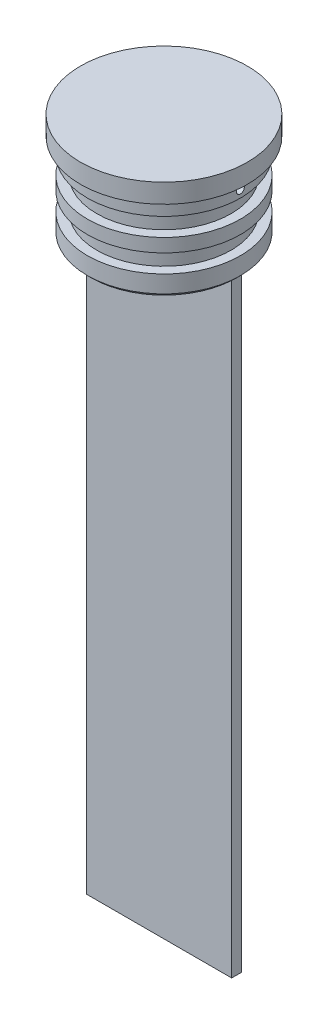
ISO-10303-21;
HEADER;
FILE_DESCRIPTION(('STEP AP214'),'2;1');
FILE_NAME('part.step','',(''),(''),'','','');
FILE_SCHEMA(('AUTOMOTIVE_DESIGN { 1 0 10303 214 1 1 1 1 }'));
ENDSEC;
DATA;
#1=APPLICATION_CONTEXT('core data for automotive mechanical design processes');
#2=APPLICATION_PROTOCOL_DEFINITION('international standard','automotive_design',2000,#1);
#3=PRODUCT_CONTEXT('',#1,'mechanical');
#4=PRODUCT('Part','Part','',(#3));
#5=PRODUCT_RELATED_PRODUCT_CATEGORY('part','',(#4));
#6=PRODUCT_DEFINITION_FORMATION('','',#4);
#7=PRODUCT_DEFINITION_CONTEXT('part definition',#1,'design');
#8=PRODUCT_DEFINITION('design','',#6,#7);
#9=PRODUCT_DEFINITION_SHAPE('','',#8);
#10=(LENGTH_UNIT() NAMED_UNIT(*) SI_UNIT(.MILLI.,.METRE.));
#11=(NAMED_UNIT(*) PLANE_ANGLE_UNIT() SI_UNIT($,.RADIAN.));
#12=(NAMED_UNIT(*) SI_UNIT($,.STERADIAN.) SOLID_ANGLE_UNIT());
#13=UNCERTAINTY_MEASURE_WITH_UNIT(LENGTH_MEASURE(1.E-05),#10,'distance_accuracy_value','');
#14=(GEOMETRIC_REPRESENTATION_CONTEXT(3) GLOBAL_UNCERTAINTY_ASSIGNED_CONTEXT((#13)) GLOBAL_UNIT_ASSIGNED_CONTEXT((#10,
#11,#12)) REPRESENTATION_CONTEXT('',''));
#15=CARTESIAN_POINT('',(0.,0.,0.));
#16=DIRECTION('',(0.,0.,1.));
#17=DIRECTION('',(1.,0.,0.));
#18=AXIS2_PLACEMENT_3D('',#15,#16,#17);
#19=CARTESIAN_POINT('',(-10.1346,0.,0.));
#20=DIRECTION('',(0.,-1.,0.));
#21=DIRECTION('',(0.,0.,-1.));
#22=AXIS2_PLACEMENT_3D('',#19,#20,#21);
#23=PLANE('',#22);
#24=DIRECTION('',(0.,0.,-1.));
#25=VECTOR('',#24,1.);
#26=CARTESIAN_POINT('',(-9.60563389683367,0.,0.635));
#27=LINE('',#26,#25);
#28=CARTESIAN_POINT('',(-9.60563389683367,0.,0.635));
#29=VERTEX_POINT('',#28);
#30=CARTESIAN_POINT('',(-9.60563389683367,0.,-0.635));
#31=VERTEX_POINT('',#30);
#32=EDGE_CURVE('E66',#29,#31,#27,.T.);
#33=ORIENTED_EDGE('',*,*,#32,.F.);
#34=CARTESIAN_POINT('',(0.,0.,0.));
#35=DIRECTION('',(0.,-1.,0.));
#36=DIRECTION('',(0.,0.,-1.));
#37=AXIS2_PLACEMENT_3D('',#34,#35,#36);
#38=CIRCLE('',#37,9.6266);
#39=EDGE_CURVE('E255',#29,#31,#38,.T.);
#40=ORIENTED_EDGE('',*,*,#39,.T.);
#41=EDGE_LOOP('',(#33,#40));
#42=FACE_BOUND('',#41,.T.);
#43=ADVANCED_FACE('F39',(#42),#23,.T.);
#44=DIRECTION('',(-1.,0.,0.));
#45=VECTOR('',#44,1.);
#46=CARTESIAN_POINT('',(-9.60563389683367,0.,0.635));
#47=LINE('',#46,#45);
#48=CARTESIAN_POINT('',(9.60563389683367,0.,0.635000000000031));
#49=VERTEX_POINT('',#48);
#50=EDGE_CURVE('E107',#49,#29,#47,.T.);
#51=ORIENTED_EDGE('',*,*,#50,.F.);
#52=EDGE_CURVE('E158',#49,#29,#38,.T.);
#53=ORIENTED_EDGE('',*,*,#52,.T.);
#54=EDGE_LOOP('',(#51,#53));
#55=FACE_BOUND('',#54,.T.);
#56=ADVANCED_FACE('F238',(#55),#23,.T.);
#57=DIRECTION('',(0.,0.,1.));
#58=VECTOR('',#57,1.);
#59=CARTESIAN_POINT('',(9.60563389683367,0.,0.635));
#60=LINE('',#59,#58);
#61=CARTESIAN_POINT('',(9.60563389683367,0.,-0.635));
#62=VERTEX_POINT('',#61);
#63=EDGE_CURVE('E251',#62,#49,#60,.T.);
#64=ORIENTED_EDGE('',*,*,#63,.F.);
#65=EDGE_CURVE('E155',#62,#49,#38,.T.);
#66=ORIENTED_EDGE('',*,*,#65,.T.);
#67=EDGE_LOOP('',(#64,#66));
#68=FACE_BOUND('',#67,.T.);
#69=ADVANCED_FACE('F221',(#68),#23,.T.);
#70=CARTESIAN_POINT('',(-10.1346,9.398,0.));
#71=DIRECTION('',(0.,-1.,0.));
#72=DIRECTION('',(0.,0.,-1.));
#73=AXIS2_PLACEMENT_3D('',#70,#71,#72);
#74=PLANE('',#73);
#75=CARTESIAN_POINT('',(0.,9.398,0.));
#76=DIRECTION('',(0.,1.,0.));
#77=DIRECTION('',(0.,0.,1.));
#78=AXIS2_PLACEMENT_3D('',#75,#76,#77);
#79=CIRCLE('',#78,8.89);
#80=CARTESIAN_POINT('',(0.,9.398,8.89));
#81=VERTEX_POINT('',#80);
#82=EDGE_CURVE('E110',#81,#81,#79,.T.);
#83=ORIENTED_EDGE('',*,*,#82,.T.);
#84=EDGE_LOOP('',(#83));
#85=FACE_BOUND('',#84,.T.);
#86=CARTESIAN_POINT('',(0.,9.398,0.));
#87=DIRECTION('',(0.,1.,0.));
#88=DIRECTION('',(0.,0.,1.));
#89=AXIS2_PLACEMENT_3D('',#86,#87,#88);
#90=CIRCLE('',#89,10.1346);
#91=CARTESIAN_POINT('',(0.,9.398,10.1346));
#92=VERTEX_POINT('',#91);
#93=EDGE_CURVE('E147',#92,#92,#90,.T.);
#94=ORIENTED_EDGE('',*,*,#93,.F.);
#95=EDGE_LOOP('',(#94));
#96=FACE_BOUND('',#95,.T.);
#97=ADVANCED_FACE('F234',(#85,#96),#74,.T.);
#98=CARTESIAN_POINT('',(0.,20.3688400990433,0.));
#99=DIRECTION('',(0.,1.,0.));
#100=DIRECTION('',(0.,0.,1.));
#101=AXIS2_PLACEMENT_3D('',#98,#99,#100);
#102=CYLINDRICAL_SURFACE('',#101,10.1346);
#103=CARTESIAN_POINT('',(-10.1205534236029,10.414,-0.5334));
#104=CARTESIAN_POINT('',(-10.1205536121464,10.3840609584769,-0.533398679411755));
#105=CARTESIAN_POINT('',(-10.1206877020375,10.3541007365576,-0.530870874435041));
#106=CARTESIAN_POINT('',(-10.1212096612489,10.2950069409855,-0.520822892998418));
#107=CARTESIAN_POINT('',(-10.1215978288808,10.2658743810902,-0.513296847978016));
#108=CARTESIAN_POINT('',(-10.1225838531584,10.2093004844766,-0.493468598960612));
#109=CARTESIAN_POINT('',(-10.1231816021669,10.1818582881073,-0.481168846307918));
#110=CARTESIAN_POINT('',(-10.1245192993215,10.1294354166762,-0.452146129710222));
#111=CARTESIAN_POINT('',(-10.1252592140841,10.1044541658105,-0.435424203840583));
#112=CARTESIAN_POINT('',(-10.1267988027599,10.0576272805655,-0.398011288975462));
#113=CARTESIAN_POINT('',(-10.1275985339612,10.035784712203,-0.377316464530746));
#114=CARTESIAN_POINT('',(-10.1291671033507,9.99588138533347,-0.332552928942506));
#115=CARTESIAN_POINT('',(-10.1299359402717,9.97782078183791,-0.30848407957522));
#116=CARTESIAN_POINT('',(-10.1313565366544,9.94598541332003,-0.257639408324739));
#117=CARTESIAN_POINT('',(-10.1320082299666,9.93221306662782,-0.230862070245239));
#118=CARTESIAN_POINT('',(-10.1331205179989,9.90936067083067,-0.175371198417729));
#119=CARTESIAN_POINT('',(-10.1335811142802,9.90028058339169,-0.146657680489775));
#120=CARTESIAN_POINT('',(-10.1342589193816,9.88707863839543,-0.0881379998586083));
#121=CARTESIAN_POINT('',(-10.1344763555222,9.88295214965469,-0.0583328846172915));
#122=CARTESIAN_POINT('',(-10.134644101096,9.87976024368991,0.00154771836247045));
#123=CARTESIAN_POINT('',(-10.134594412806,9.88069478332828,0.0316232037942387));
#124=CARTESIAN_POINT('',(-10.1342336998235,9.8875945675563,0.0911594538143426));
#125=CARTESIAN_POINT('',(-10.1339229340489,9.89355482801736,0.120620797809831));
#126=CARTESIAN_POINT('',(-10.1330753650302,9.91032913619272,0.178124219283356));
#127=CARTESIAN_POINT('',(-10.1325385607632,9.92114320587159,0.206166290338221));
#128=CARTESIAN_POINT('',(-10.1312989311418,9.94732383610626,0.260051193995274));
#129=CARTESIAN_POINT('',(-10.1305960230931,9.96269266520918,0.285892922417169));
#130=CARTESIAN_POINT('',(-10.1291033343434,9.99754489422707,0.33463152250589));
#131=CARTESIAN_POINT('',(-10.1283135529589,10.0170283265129,0.357528371002167));
#132=CARTESIAN_POINT('',(-10.1267349172471,10.0595848700228,0.399756326371677));
#133=CARTESIAN_POINT('',(-10.1259460652055,10.0826623057789,0.41908307541589));
#134=CARTESIAN_POINT('',(-10.1244591830369,10.1317365883295,0.453588639978021));
#135=CARTESIAN_POINT('',(-10.1237611529362,10.1577334359645,0.468767454301576));
#136=CARTESIAN_POINT('',(-10.1225347057919,10.2119112443445,0.494545911593178));
#137=CARTESIAN_POINT('',(-10.1220062949581,10.2400922850069,0.505145386914533));
#138=CARTESIAN_POINT('',(-10.121178909836,10.2978373196118,0.52146135654842));
#139=CARTESIAN_POINT('',(-10.1208799336356,10.327401302027,0.527177891554696));
#140=CARTESIAN_POINT('',(-10.120545488096,10.3870350359619,0.53356031175169));
#141=CARTESIAN_POINT('',(-10.1205097030998,10.4171041382515,0.534232247177286));
#142=CARTESIAN_POINT('',(-10.1207048512828,10.4769279380717,0.530522186904345));
#143=CARTESIAN_POINT('',(-10.1209357834831,10.506682636756,0.52614020975667));
#144=CARTESIAN_POINT('',(-10.121638050369,10.5650159858181,0.512451732069377));
#145=CARTESIAN_POINT('',(-10.1221092496993,10.5935952885735,0.503148004104327));
#146=CARTESIAN_POINT('',(-10.1232388289093,10.6487866884438,0.479882929856249));
#147=CARTESIAN_POINT('',(-10.1238972099908,10.6753987729281,0.465921553671906));
#148=CARTESIAN_POINT('',(-10.1253277171654,10.7259281434284,0.433721980065567));
#149=CARTESIAN_POINT('',(-10.126099951034,10.7498428377599,0.415479720484483));
#150=CARTESIAN_POINT('',(-10.1276707492125,10.7942725003387,0.375242141196447));
#151=CARTESIAN_POINT('',(-10.1284693137079,10.8147874446351,0.353246795051487));
#152=CARTESIAN_POINT('',(-10.1300036933725,10.8518556147153,0.306101413291947));
#153=CARTESIAN_POINT('',(-10.1307394461639,10.8684049310707,0.280948301575624));
#154=CARTESIAN_POINT('',(-10.1320643926763,10.897045340145,0.228216926025011));
#155=CARTESIAN_POINT('',(-10.1326535870864,10.9091364538319,0.200638673597497));
#156=CARTESIAN_POINT('',(-10.133618718947,10.9285104060322,0.14385437221848));
#157=CARTESIAN_POINT('',(-10.1339947670791,10.9357957403924,0.11464917676835));
#158=CARTESIAN_POINT('',(-10.1344916679141,10.9453595024191,0.0554280837306605));
#159=CARTESIAN_POINT('',(-10.1346125222624,10.947637962368,0.0254121913714276));
#160=CARTESIAN_POINT('',(-10.1345854227455,10.9471229921062,-0.0345394746706937));
#161=CARTESIAN_POINT('',(-10.1344377937389,10.9443356913491,-0.0644753013446941));
#162=CARTESIAN_POINT('',(-10.1338909845196,10.9337809990915,-0.123453345907919));
#163=CARTESIAN_POINT('',(-10.1334918038383,10.9260135983157,-0.1524955621327));
#164=CARTESIAN_POINT('',(-10.1324867931905,10.905720477635,-0.208863185894305));
#165=CARTESIAN_POINT('',(-10.1318809621863,10.8931947338369,-0.236188584809665));
#166=CARTESIAN_POINT('',(-10.1305307629354,10.8637414953699,-0.288349042122926));
#167=CARTESIAN_POINT('',(-10.1297863988147,10.8468141317844,-0.313184174652245));
#168=CARTESIAN_POINT('',(-10.1282418658416,10.8090160258209,-0.359689863587585));
#169=CARTESIAN_POINT('',(-10.1274416365457,10.7881409691609,-0.381356911342619));
#170=CARTESIAN_POINT('',(-10.1258759936888,10.7430436655474,-0.420885950573217));
#171=CARTESIAN_POINT('',(-10.1251105887333,10.7188205971745,-0.438747005523939));
#172=CARTESIAN_POINT('',(-10.1237003676491,10.6676941717302,-0.470166353728063));
#173=CARTESIAN_POINT('',(-10.1230556744992,10.6407881235861,-0.483720268640747));
#174=CARTESIAN_POINT('',(-10.1219615023649,10.5850989087634,-0.506102014922759));
#175=CARTESIAN_POINT('',(-10.1215117932884,10.5563180009314,-0.514935419636537));
#176=CARTESIAN_POINT('',(-10.120977180716,10.508465661188,-0.525312418960884));
#177=CARTESIAN_POINT('',(-10.1208189744007,10.4897040619379,-0.528341380250392));
#178=CARTESIAN_POINT('',(-10.1206070361096,10.4519644810557,-0.532385588546817));
#179=CARTESIAN_POINT('',(-10.1205533040339,10.4329864996305,-0.533400837479991));
#180=CARTESIAN_POINT('',(-10.1205534236029,10.414,-0.5334));
#181=B_SPLINE_CURVE_WITH_KNOTS('',3,(#103,#104,#105,#106,#107,#108,#109,#110,#111,#112,#113,
#114,#115,#116,#117,#118,#119,#120,#121,#122,#123,#124,#125,#126,#127,#128,#129,#130,#131,#132,
#133,#134,#135,#136,#137,#138,#139,#140,#141,#142,#143,#144,#145,#146,#147,#148,#149,#150,#151,
#152,#153,#154,#155,#156,#157,#158,#159,#160,#161,#162,#163,#164,#165,#166,#167,#168,#169,#170,
#171,#172,#173,#174,#175,#176,#177,#178,#179,#180),.UNSPECIFIED.,.T.,.F.,(4,2,2,2,2,2,2,2,2,2,2,
2,2,2,2,2,2,2,2,2,2,2,2,2,2,2,2,2,2,2,2,2,2,2,2,2,2,2,4),(0.,0.0897478156737939,
0.179601193272618,0.269408491224996,0.359194726203806,0.44906808100993,0.538945118736538,
0.628872750523029,0.718799647621717,0.808642405260603,0.898484397127532,0.988237395173397,
1.07799079937609,1.16778898157327,1.25758787026647,1.34749565760341,1.43740347082852,
1.52731457524271,1.61722493034297,1.70702743430625,1.79682960864202,1.88658124841989,
1.97633346439921,2.06617119372077,2.15600955591574,2.24593612226999,2.33586226567257,
2.42574166973739,2.51562049429241,2.60539063993941,2.69516095278274,2.78493171639607,
2.87469980687735,2.9645665744061,3.05445542960686,3.14443536945332,3.23430883703432,
3.29122443661395,3.34813998174977),.UNSPECIFIED.);
#182=CARTESIAN_POINT('',(-10.1205534236029,10.414,-0.5334));
#183=VERTEX_POINT('',#182);
#184=EDGE_CURVE('E43',#183,#183,#181,.T.);
#185=ORIENTED_EDGE('',*,*,#184,.F.);
#186=EDGE_LOOP('',(#185));
#187=FACE_BOUND('',#186,.T.);
#188=CARTESIAN_POINT('',(10.1205534236029,10.414,-0.5334));
#189=CARTESIAN_POINT('',(10.1205536121464,10.4439390415231,-0.533398679411755));
#190=CARTESIAN_POINT('',(10.1206877020375,10.4738992634424,-0.530870874435041));
#191=CARTESIAN_POINT('',(10.1212096612489,10.5329930590145,-0.520822892998418));
#192=CARTESIAN_POINT('',(10.1215978288808,10.5621256189098,-0.513296847978016));
#193=CARTESIAN_POINT('',(10.1225838531584,10.6186995155234,-0.493468598960612));
#194=CARTESIAN_POINT('',(10.1231816021669,10.6461417118927,-0.481168846307917));
#195=CARTESIAN_POINT('',(10.1245192993215,10.6985645833238,-0.452146129710221));
#196=CARTESIAN_POINT('',(10.1252592140841,10.7235458341896,-0.435424203840583));
#197=CARTESIAN_POINT('',(10.1267988027599,10.7703727194345,-0.398011288975462));
#198=CARTESIAN_POINT('',(10.1275985339612,10.792215287797,-0.377316464530746));
#199=CARTESIAN_POINT('',(10.1291671033507,10.8321186146665,-0.332552928942505));
#200=CARTESIAN_POINT('',(10.1299359402717,10.8501792181621,-0.30848407957522));
#201=CARTESIAN_POINT('',(10.1313565366544,10.88201458668,-0.257639408324739));
#202=CARTESIAN_POINT('',(10.1320082299666,10.8957869333722,-0.230862070245239));
#203=CARTESIAN_POINT('',(10.1331205179989,10.9186393291693,-0.175371198417729));
#204=CARTESIAN_POINT('',(10.1335811142802,10.9277194166083,-0.146657680489775));
#205=CARTESIAN_POINT('',(10.1342589193816,10.9409213616046,-0.0881379998586082));
#206=CARTESIAN_POINT('',(10.1344763555222,10.9450478503453,-0.0583328846172914));
#207=CARTESIAN_POINT('',(10.134644101096,10.9482397563101,0.00154771836247051));
#208=CARTESIAN_POINT('',(10.134594412806,10.9473052166717,0.0316232037942388));
#209=CARTESIAN_POINT('',(10.1342336998235,10.9404054324437,0.0911594538143426));
#210=CARTESIAN_POINT('',(10.1339229340489,10.9344451719826,0.120620797809831));
#211=CARTESIAN_POINT('',(10.1330753650302,10.9176708638073,0.178124219283356));
#212=CARTESIAN_POINT('',(10.1325385607632,10.9068567941284,0.206166290338221));
#213=CARTESIAN_POINT('',(10.1312989311418,10.8806761638938,0.260051193995274));
#214=CARTESIAN_POINT('',(10.1305960230931,10.8653073347908,0.285892922417169));
#215=CARTESIAN_POINT('',(10.1291033343434,10.8304551057729,0.33463152250589));
#216=CARTESIAN_POINT('',(10.1283135529589,10.8109716734872,0.357528371002167));
#217=CARTESIAN_POINT('',(10.1267349172471,10.7684151299772,0.399756326371677));
#218=CARTESIAN_POINT('',(10.1259460652055,10.7453376942211,0.419083075415889));
#219=CARTESIAN_POINT('',(10.1244591830369,10.6962634116705,0.45358863997802));
#220=CARTESIAN_POINT('',(10.1237611529362,10.6702665640355,0.468767454301575));
#221=CARTESIAN_POINT('',(10.1225347057919,10.6160887556555,0.494545911593178));
#222=CARTESIAN_POINT('',(10.1220062949581,10.5879077149931,0.505145386914533));
#223=CARTESIAN_POINT('',(10.121178909836,10.5301626803882,0.52146135654842));
#224=CARTESIAN_POINT('',(10.1208799336356,10.500598697973,0.527177891554696));
#225=CARTESIAN_POINT('',(10.120545488096,10.4409649640381,0.53356031175169));
#226=CARTESIAN_POINT('',(10.1205097030998,10.4108958617486,0.534232247177286));
#227=CARTESIAN_POINT('',(10.1207048512828,10.3510720619283,0.530522186904345));
#228=CARTESIAN_POINT('',(10.1209357834831,10.321317363244,0.52614020975667));
#229=CARTESIAN_POINT('',(10.121638050369,10.2629840141819,0.512451732069377));
#230=CARTESIAN_POINT('',(10.1221092496993,10.2344047114265,0.503148004104327));
#231=CARTESIAN_POINT('',(10.1232388289093,10.1792133115562,0.479882929856249));
#232=CARTESIAN_POINT('',(10.1238972099908,10.1526012270719,0.465921553671906));
#233=CARTESIAN_POINT('',(10.1253277171654,10.1020718565716,0.433721980065567));
#234=CARTESIAN_POINT('',(10.126099951034,10.0781571622401,0.415479720484483));
#235=CARTESIAN_POINT('',(10.1276707492125,10.0337274996613,0.375242141196447));
#236=CARTESIAN_POINT('',(10.1284693137079,10.0132125553649,0.353246795051487));
#237=CARTESIAN_POINT('',(10.1300036933725,9.97614438528476,0.306101413291947));
#238=CARTESIAN_POINT('',(10.1307394461639,9.95959506892929,0.280948301575624));
#239=CARTESIAN_POINT('',(10.1320643926763,9.93095465985497,0.228216926025011));
#240=CARTESIAN_POINT('',(10.1326535870864,9.91886354616811,0.200638673597497));
#241=CARTESIAN_POINT('',(10.133618718947,9.89948959396778,0.14385437221848));
#242=CARTESIAN_POINT('',(10.1339947670791,9.89220425960758,0.11464917676835));
#243=CARTESIAN_POINT('',(10.1344916679141,9.88264049758093,0.0554280837306605));
#244=CARTESIAN_POINT('',(10.1346125222624,9.88036203763206,0.0254121913714276));
#245=CARTESIAN_POINT('',(10.1345854227455,9.88087700789378,-0.0345394746706937));
#246=CARTESIAN_POINT('',(10.1344377937389,9.88366430865095,-0.0644753013446941));
#247=CARTESIAN_POINT('',(10.1338909845196,9.89421900090852,-0.123453345907919));
#248=CARTESIAN_POINT('',(10.1334918038383,9.90198640168429,-0.1524955621327));
#249=CARTESIAN_POINT('',(10.1324867931905,9.92227952236506,-0.208863185894305));
#250=CARTESIAN_POINT('',(10.1318809621863,9.93480526616314,-0.236188584809665));
#251=CARTESIAN_POINT('',(10.1305307629354,9.96425850463012,-0.288349042122926));
#252=CARTESIAN_POINT('',(10.1297863988147,9.9811858682156,-0.313184174652245));
#253=CARTESIAN_POINT('',(10.1282418658416,10.0189839741791,-0.359689863587584));
#254=CARTESIAN_POINT('',(10.1274416365457,10.0398590308392,-0.381356911342618));
#255=CARTESIAN_POINT('',(10.1258759936888,10.0849563344526,-0.420885950573217));
#256=CARTESIAN_POINT('',(10.1251105887333,10.1091794028255,-0.438747005523938));
#257=CARTESIAN_POINT('',(10.1237003676491,10.1603058282698,-0.470166353728063));
#258=CARTESIAN_POINT('',(10.1230556744992,10.1872118764139,-0.483720268640747));
#259=CARTESIAN_POINT('',(10.1219615023649,10.2429010912366,-0.506102014922759));
#260=CARTESIAN_POINT('',(10.1215117932884,10.2716819990686,-0.514935419636537));
#261=CARTESIAN_POINT('',(10.120977180716,10.3195343388121,-0.525312418960884));
#262=CARTESIAN_POINT('',(10.1208189744007,10.3382959380621,-0.528341380250392));
#263=CARTESIAN_POINT('',(10.1206070361096,10.3760355189443,-0.532385588546817));
#264=CARTESIAN_POINT('',(10.1205533040339,10.3950135003695,-0.533400837479991));
#265=CARTESIAN_POINT('',(10.1205534236029,10.414,-0.5334));
#266=B_SPLINE_CURVE_WITH_KNOTS('',3,(#188,#189,#190,#191,#192,#193,#194,#195,#196,#197,#198,
#199,#200,#201,#202,#203,#204,#205,#206,#207,#208,#209,#210,#211,#212,#213,#214,#215,#216,#217,
#218,#219,#220,#221,#222,#223,#224,#225,#226,#227,#228,#229,#230,#231,#232,#233,#234,#235,#236,
#237,#238,#239,#240,#241,#242,#243,#244,#245,#246,#247,#248,#249,#250,#251,#252,#253,#254,#255,
#256,#257,#258,#259,#260,#261,#262,#263,#264,#265),.UNSPECIFIED.,.T.,.F.,(4,2,2,2,2,2,2,2,2,2,2,
2,2,2,2,2,2,2,2,2,2,2,2,2,2,2,2,2,2,2,2,2,2,2,2,2,2,2,4),(0.,0.0897478156737939,
0.179601193272618,0.269408491224998,0.359194726203806,0.44906808100993,0.538945118736538,
0.628872750523028,0.718799647621717,0.808642405260603,0.898484397127532,0.988237395173397,
1.07799079937609,1.16778898157327,1.25758787026647,1.34749565760341,1.43740347082852,
1.52731457524271,1.61722493034297,1.70702743430625,1.79682960864202,1.88658124841989,
1.97633346439921,2.06617119372077,2.15600955591574,2.24593612226999,2.33586226567257,
2.42574166973739,2.51562049429241,2.60539063993942,2.69516095278274,2.78493171639607,
2.87469980687735,2.96456657440609,3.05445542960686,3.14443536945332,3.23430883703432,
3.29122443661395,3.34813998174977),.UNSPECIFIED.);
#267=CARTESIAN_POINT('',(10.1205534236029,10.414,-0.5334));
#268=VERTEX_POINT('',#267);
#269=EDGE_CURVE('E160',#268,#268,#266,.T.);
#270=ORIENTED_EDGE('',*,*,#269,.F.);
#271=EDGE_LOOP('',(#270));
#272=FACE_BOUND('',#271,.T.);
#273=CARTESIAN_POINT('',(0.,11.303,0.));
#274=DIRECTION('',(0.,-1.,0.));
#275=DIRECTION('',(0.,0.,-1.));
#276=AXIS2_PLACEMENT_3D('',#273,#274,#275);
#277=CIRCLE('',#276,10.1346);
#278=CARTESIAN_POINT('',(0.,11.303,-10.1346));
#279=VERTEX_POINT('',#278);
#280=EDGE_CURVE('E11',#279,#279,#277,.T.);
#281=ORIENTED_EDGE('',*,*,#280,.T.);
#282=EDGE_LOOP('',(#281));
#283=FACE_BOUND('',#282,.T.);
#284=ORIENTED_EDGE('',*,*,#93,.T.);
#285=EDGE_LOOP('',(#284));
#286=FACE_BOUND('',#285,.T.);
#287=ADVANCED_FACE('F164',(#187,#272,#283,#286),#102,.T.);
#288=CARTESIAN_POINT('',(-11.049,11.43,0.));
#289=DIRECTION('',(0.,-1.,0.));
#290=DIRECTION('',(0.,0.,-1.));
#291=AXIS2_PLACEMENT_3D('',#288,#289,#290);
#292=PLANE('',#291);
#293=CARTESIAN_POINT('',(0.,11.43,0.));
#294=DIRECTION('',(0.,-1.,0.));
#295=DIRECTION('',(0.,0.,-1.));
#296=AXIS2_PLACEMENT_3D('',#293,#294,#295);
#297=CIRCLE('',#296,10.2616);
#298=CARTESIAN_POINT('',(0.,11.43,-10.2616));
#299=VERTEX_POINT('',#298);
#300=EDGE_CURVE('E52',#299,#299,#297,.F.);
#301=ORIENTED_EDGE('',*,*,#300,.T.);
#302=EDGE_LOOP('',(#301));
#303=FACE_BOUND('',#302,.T.);
#304=CARTESIAN_POINT('',(0.,11.43,0.));
#305=DIRECTION('',(0.,1.,0.));
#306=DIRECTION('',(0.,0.,1.));
#307=AXIS2_PLACEMENT_3D('',#304,#305,#306);
#308=CIRCLE('',#307,11.049);
#309=CARTESIAN_POINT('',(0.,11.43,11.049));
#310=VERTEX_POINT('',#309);
#311=EDGE_CURVE('E144',#310,#310,#308,.T.);
#312=ORIENTED_EDGE('',*,*,#311,.F.);
#313=EDGE_LOOP('',(#312));
#314=FACE_BOUND('',#313,.T.);
#315=ADVANCED_FACE('F227',(#303,#314),#292,.T.);
#316=CARTESIAN_POINT('',(0.,20.3688400990433,0.));
#317=DIRECTION('',(0.,1.,0.));
#318=DIRECTION('',(0.,0.,1.));
#319=AXIS2_PLACEMENT_3D('',#316,#317,#318);
#320=CYLINDRICAL_SURFACE('',#319,11.049);
#321=ORIENTED_EDGE('',*,*,#311,.T.);
#322=EDGE_LOOP('',(#321));
#323=FACE_BOUND('',#322,.T.);
#324=CARTESIAN_POINT('',(0.,13.97,0.));
#325=DIRECTION('',(0.,1.,0.));
#326=DIRECTION('',(0.,0.,1.));
#327=AXIS2_PLACEMENT_3D('',#324,#325,#326);
#328=CIRCLE('',#327,11.049);
#329=CARTESIAN_POINT('',(0.,13.97,11.049));
#330=VERTEX_POINT('',#329);
#331=EDGE_CURVE('E141',#330,#330,#328,.T.);
#332=ORIENTED_EDGE('',*,*,#331,.F.);
#333=EDGE_LOOP('',(#332));
#334=FACE_BOUND('',#333,.T.);
#335=ADVANCED_FACE('F224',(#323,#334),#320,.T.);
#336=CARTESIAN_POINT('',(0.,13.97,0.));
#337=DIRECTION('',(0.,1.,0.));
#338=DIRECTION('',(0.,0.,1.));
#339=AXIS2_PLACEMENT_3D('',#336,#337,#338);
#340=PLANE('',#339);
#341=ORIENTED_EDGE('',*,*,#331,.T.);
#342=EDGE_LOOP('',(#341));
#343=FACE_BOUND('',#342,.T.);
#344=ADVANCED_FACE('F220',(#343),#340,.T.);
#345=DIRECTION('',(1.,0.,0.));
#346=VECTOR('',#345,1.);
#347=CARTESIAN_POINT('',(-9.60563389683367,0.,-0.635));
#348=LINE('',#347,#346);
#349=EDGE_CURVE('E59',#31,#62,#348,.T.);
#350=ORIENTED_EDGE('',*,*,#349,.F.);
#351=EDGE_CURVE('E154',#31,#62,#38,.T.);
#352=ORIENTED_EDGE('',*,*,#351,.T.);
#353=EDGE_LOOP('',(#350,#352));
#354=FACE_BOUND('',#353,.T.);
#355=ADVANCED_FACE('F216',(#354),#23,.T.);
#356=CARTESIAN_POINT('',(0.,20.3688400990433,0.));
#357=DIRECTION('',(0.,1.,0.));
#358=DIRECTION('',(0.,0.,1.));
#359=AXIS2_PLACEMENT_3D('',#356,#357,#358);
#360=CYLINDRICAL_SURFACE('',#359,10.1346);
#361=CARTESIAN_POINT('',(0.,0.508000000000002,0.));
#362=DIRECTION('',(0.,-1.,0.));
#363=DIRECTION('',(0.,0.,-1.));
#364=AXIS2_PLACEMENT_3D('',#361,#362,#363);
#365=CIRCLE('',#364,10.1346);
#366=CARTESIAN_POINT('',(0.,0.508000000000002,-10.1346));
#367=VERTEX_POINT('',#366);
#368=EDGE_CURVE('E151',#367,#367,#365,.F.);
#369=ORIENTED_EDGE('',*,*,#368,.T.);
#370=EDGE_LOOP('',(#369));
#371=FACE_BOUND('',#370,.T.);
#372=CARTESIAN_POINT('',(0.,2.794,0.));
#373=DIRECTION('',(0.,1.,0.));
#374=DIRECTION('',(0.,0.,1.));
#375=AXIS2_PLACEMENT_3D('',#372,#373,#374);
#376=CIRCLE('',#375,10.1346);
#377=CARTESIAN_POINT('',(0.,2.794,10.1346));
#378=VERTEX_POINT('',#377);
#379=EDGE_CURVE('E138',#378,#378,#376,.T.);
#380=ORIENTED_EDGE('',*,*,#379,.F.);
#381=EDGE_LOOP('',(#380));
#382=FACE_BOUND('',#381,.T.);
#383=ADVANCED_FACE('F212',(#371,#382),#360,.T.);
#384=CARTESIAN_POINT('',(-8.89,2.794,0.));
#385=DIRECTION('',(0.,1.,0.));
#386=DIRECTION('',(0.,0.,1.));
#387=AXIS2_PLACEMENT_3D('',#384,#385,#386);
#388=PLANE('',#387);
#389=ORIENTED_EDGE('',*,*,#379,.T.);
#390=EDGE_LOOP('',(#389));
#391=FACE_BOUND('',#390,.T.);
#392=CARTESIAN_POINT('',(0.,2.794,0.));
#393=DIRECTION('',(0.,1.,0.));
#394=DIRECTION('',(0.,0.,1.));
#395=AXIS2_PLACEMENT_3D('',#392,#393,#394);
#396=CIRCLE('',#395,8.89);
#397=CARTESIAN_POINT('',(0.,2.794,8.89));
#398=VERTEX_POINT('',#397);
#399=EDGE_CURVE('E135',#398,#398,#396,.T.);
#400=ORIENTED_EDGE('',*,*,#399,.F.);
#401=EDGE_LOOP('',(#400));
#402=FACE_BOUND('',#401,.T.);
#403=ADVANCED_FACE('F208',(#391,#402),#388,.T.);
#404=CARTESIAN_POINT('',(0.,20.3688400990433,0.));
#405=DIRECTION('',(0.,1.,0.));
#406=DIRECTION('',(0.,0.,1.));
#407=AXIS2_PLACEMENT_3D('',#404,#405,#406);
#408=CYLINDRICAL_SURFACE('',#407,8.89);
#409=ORIENTED_EDGE('',*,*,#399,.T.);
#410=EDGE_LOOP('',(#409));
#411=FACE_BOUND('',#410,.T.);
#412=CARTESIAN_POINT('',(0.,5.207,0.));
#413=DIRECTION('',(0.,1.,0.));
#414=DIRECTION('',(0.,0.,1.));
#415=AXIS2_PLACEMENT_3D('',#412,#413,#414);
#416=CIRCLE('',#415,8.88999999999999);
#417=CARTESIAN_POINT('',(0.,5.207,8.88999999999999));
#418=VERTEX_POINT('',#417);
#419=EDGE_CURVE('E131',#418,#418,#416,.T.);
#420=ORIENTED_EDGE('',*,*,#419,.F.);
#421=EDGE_LOOP('',(#420));
#422=FACE_BOUND('',#421,.T.);
#423=ADVANCED_FACE('F204',(#411,#422),#408,.T.);
#424=CARTESIAN_POINT('',(-10.1346,5.207,0.));
#425=DIRECTION('',(0.,-1.,0.));
#426=DIRECTION('',(0.,0.,-1.));
#427=AXIS2_PLACEMENT_3D('',#424,#425,#426);
#428=PLANE('',#427);
#429=ORIENTED_EDGE('',*,*,#419,.T.);
#430=EDGE_LOOP('',(#429));
#431=FACE_BOUND('',#430,.T.);
#432=CARTESIAN_POINT('',(0.,5.207,0.));
#433=DIRECTION('',(0.,1.,0.));
#434=DIRECTION('',(0.,0.,1.));
#435=AXIS2_PLACEMENT_3D('',#432,#433,#434);
#436=CIRCLE('',#435,10.1346);
#437=CARTESIAN_POINT('',(0.,5.207,10.1346));
#438=VERTEX_POINT('',#437);
#439=EDGE_CURVE('E127',#438,#438,#436,.T.);
#440=ORIENTED_EDGE('',*,*,#439,.F.);
#441=EDGE_LOOP('',(#440));
#442=FACE_BOUND('',#441,.T.);
#443=ADVANCED_FACE('F200',(#431,#442),#428,.T.);
#444=CARTESIAN_POINT('',(0.,20.3688400990433,0.));
#445=DIRECTION('',(0.,1.,0.));
#446=DIRECTION('',(0.,0.,1.));
#447=AXIS2_PLACEMENT_3D('',#444,#445,#446);
#448=CYLINDRICAL_SURFACE('',#447,10.1346);
#449=ORIENTED_EDGE('',*,*,#439,.T.);
#450=EDGE_LOOP('',(#449));
#451=FACE_BOUND('',#450,.T.);
#452=CARTESIAN_POINT('',(0.,6.985,0.));
#453=DIRECTION('',(0.,1.,0.));
#454=DIRECTION('',(0.,0.,1.));
#455=AXIS2_PLACEMENT_3D('',#452,#453,#454);
#456=CIRCLE('',#455,10.1346);
#457=CARTESIAN_POINT('',(0.,6.985,10.1346));
#458=VERTEX_POINT('',#457);
#459=EDGE_CURVE('E123',#458,#458,#456,.T.);
#460=ORIENTED_EDGE('',*,*,#459,.F.);
#461=EDGE_LOOP('',(#460));
#462=FACE_BOUND('',#461,.T.);
#463=ADVANCED_FACE('F196',(#451,#462),#448,.T.);
#464=CARTESIAN_POINT('',(-8.89,6.985,0.));
#465=DIRECTION('',(0.,1.,0.));
#466=DIRECTION('',(0.,0.,1.));
#467=AXIS2_PLACEMENT_3D('',#464,#465,#466);
#468=PLANE('',#467);
#469=ORIENTED_EDGE('',*,*,#459,.T.);
#470=EDGE_LOOP('',(#469));
#471=FACE_BOUND('',#470,.T.);
#472=CARTESIAN_POINT('',(0.,6.985,0.));
#473=DIRECTION('',(0.,1.,0.));
#474=DIRECTION('',(0.,0.,1.));
#475=AXIS2_PLACEMENT_3D('',#472,#473,#474);
#476=CIRCLE('',#475,8.89);
#477=CARTESIAN_POINT('',(0.,6.985,8.89));
#478=VERTEX_POINT('',#477);
#479=EDGE_CURVE('E114',#478,#478,#476,.T.);
#480=ORIENTED_EDGE('',*,*,#479,.F.);
#481=EDGE_LOOP('',(#480));
#482=FACE_BOUND('',#481,.T.);
#483=ADVANCED_FACE('F192',(#471,#482),#468,.T.);
#484=CARTESIAN_POINT('',(0.,20.3688400990433,0.));
#485=DIRECTION('',(0.,1.,0.));
#486=DIRECTION('',(0.,0.,1.));
#487=AXIS2_PLACEMENT_3D('',#484,#485,#486);
#488=CYLINDRICAL_SURFACE('',#487,8.89);
#489=ORIENTED_EDGE('',*,*,#479,.T.);
#490=EDGE_LOOP('',(#489));
#491=FACE_BOUND('',#490,.T.);
#492=ORIENTED_EDGE('',*,*,#82,.F.);
#493=EDGE_LOOP('',(#492));
#494=FACE_BOUND('',#493,.T.);
#495=ADVANCED_FACE('F189',(#491,#494),#488,.T.);
#496=CARTESIAN_POINT('',(0.,0.508000000000002,0.));
#497=DIRECTION('',(0.,1.,0.));
#498=DIRECTION('',(0.,0.,1.));
#499=AXIS2_PLACEMENT_3D('',#496,#497,#498);
#500=CONICAL_SURFACE('',#499,10.1346,0.785398163397447);
#501=ORIENTED_EDGE('',*,*,#65,.F.);
#502=ORIENTED_EDGE('',*,*,#351,.F.);
#503=ORIENTED_EDGE('',*,*,#39,.F.);
#504=ORIENTED_EDGE('',*,*,#52,.F.);
#505=EDGE_LOOP('',(#501,#502,#503,#504));
#506=FACE_BOUND('',#505,.T.);
#507=ORIENTED_EDGE('',*,*,#368,.F.);
#508=EDGE_LOOP('',(#507));
#509=FACE_BOUND('',#508,.T.);
#510=ADVANCED_FACE('F188',(#506,#509),#500,.T.);
#511=CARTESIAN_POINT('',(-9.60563389683367,-80.01,0.635));
#512=DIRECTION('',(1.,0.,0.));
#513=DIRECTION('',(0.,0.,-1.));
#514=AXIS2_PLACEMENT_3D('',#511,#512,#513);
#515=PLANE('',#514);
#516=ORIENTED_EDGE('',*,*,#32,.T.);
#517=DIRECTION('',(0.,1.,0.));
#518=VECTOR('',#517,1.);
#519=CARTESIAN_POINT('',(-9.60563389683367,-80.01,-0.635));
#520=LINE('',#519,#518);
#521=CARTESIAN_POINT('',(-9.60563389683367,-80.01,-0.635));
#522=VERTEX_POINT('',#521);
#523=EDGE_CURVE('E92',#522,#31,#520,.T.);
#524=ORIENTED_EDGE('',*,*,#523,.F.);
#525=DIRECTION('',(0.,0.,-1.));
#526=VECTOR('',#525,1.);
#527=CARTESIAN_POINT('',(-9.60563389683367,-80.01,0.635));
#528=LINE('',#527,#526);
#529=CARTESIAN_POINT('',(-9.60563389683367,-80.01,0.635));
#530=VERTEX_POINT('',#529);
#531=EDGE_CURVE('E98',#530,#522,#528,.T.);
#532=ORIENTED_EDGE('',*,*,#531,.F.);
#533=DIRECTION('',(0.,1.,0.));
#534=VECTOR('',#533,1.);
#535=CARTESIAN_POINT('',(-9.60563389683367,-80.01,0.635));
#536=LINE('',#535,#534);
#537=EDGE_CURVE('E260',#530,#29,#536,.T.);
#538=ORIENTED_EDGE('',*,*,#537,.T.);
#539=EDGE_LOOP('',(#516,#524,#532,#538));
#540=FACE_BOUND('',#539,.T.);
#541=ADVANCED_FACE('F109',(#540),#515,.F.);
#542=CARTESIAN_POINT('',(-9.60563389683367,-80.01,-0.635));
#543=DIRECTION('',(0.,0.,1.));
#544=DIRECTION('',(1.,0.,0.));
#545=AXIS2_PLACEMENT_3D('',#542,#543,#544);
#546=PLANE('',#545);
#547=ORIENTED_EDGE('',*,*,#349,.T.);
#548=DIRECTION('',(0.,1.,0.));
#549=VECTOR('',#548,1.);
#550=CARTESIAN_POINT('',(9.60563389683367,-80.01,-0.635));
#551=LINE('',#550,#549);
#552=CARTESIAN_POINT('',(9.60563389683367,-80.01,-0.635));
#553=VERTEX_POINT('',#552);
#554=EDGE_CURVE('E94',#553,#62,#551,.T.);
#555=ORIENTED_EDGE('',*,*,#554,.F.);
#556=DIRECTION('',(1.,0.,0.));
#557=VECTOR('',#556,1.);
#558=CARTESIAN_POINT('',(-9.60563389683367,-80.01,-0.635));
#559=LINE('',#558,#557);
#560=EDGE_CURVE('E88',#522,#553,#559,.T.);
#561=ORIENTED_EDGE('',*,*,#560,.F.);
#562=ORIENTED_EDGE('',*,*,#523,.T.);
#563=EDGE_LOOP('',(#547,#555,#561,#562));
#564=FACE_BOUND('',#563,.T.);
#565=ADVANCED_FACE('F90',(#564),#546,.F.);
#566=CARTESIAN_POINT('',(9.60563389683367,-80.01,0.635));
#567=DIRECTION('',(-1.,0.,0.));
#568=DIRECTION('',(0.,0.,1.));
#569=AXIS2_PLACEMENT_3D('',#566,#567,#568);
#570=PLANE('',#569);
#571=ORIENTED_EDGE('',*,*,#63,.T.);
#572=DIRECTION('',(0.,1.,0.));
#573=VECTOR('',#572,1.);
#574=CARTESIAN_POINT('',(9.60563389683367,-80.01,0.635));
#575=LINE('',#574,#573);
#576=CARTESIAN_POINT('',(9.60563389683367,-80.01,0.635));
#577=VERTEX_POINT('',#576);
#578=EDGE_CURVE('E116',#577,#49,#575,.T.);
#579=ORIENTED_EDGE('',*,*,#578,.F.);
#580=DIRECTION('',(0.,0.,1.));
#581=VECTOR('',#580,1.);
#582=CARTESIAN_POINT('',(9.60563389683367,-80.01,0.635));
#583=LINE('',#582,#581);
#584=EDGE_CURVE('E97',#553,#577,#583,.T.);
#585=ORIENTED_EDGE('',*,*,#584,.F.);
#586=ORIENTED_EDGE('',*,*,#554,.T.);
#587=EDGE_LOOP('',(#571,#579,#585,#586));
#588=FACE_BOUND('',#587,.T.);
#589=ADVANCED_FACE('F179',(#588),#570,.F.);
#590=CARTESIAN_POINT('',(-9.60563389683367,-80.01,0.635));
#591=DIRECTION('',(0.,0.,-1.));
#592=DIRECTION('',(-1.,0.,0.));
#593=AXIS2_PLACEMENT_3D('',#590,#591,#592);
#594=PLANE('',#593);
#595=ORIENTED_EDGE('',*,*,#50,.T.);
#596=ORIENTED_EDGE('',*,*,#537,.F.);
#597=DIRECTION('',(-1.,0.,0.));
#598=VECTOR('',#597,1.);
#599=CARTESIAN_POINT('',(-9.60563389683367,-80.01,0.635));
#600=LINE('',#599,#598);
#601=EDGE_CURVE('E103',#577,#530,#600,.T.);
#602=ORIENTED_EDGE('',*,*,#601,.F.);
#603=ORIENTED_EDGE('',*,*,#578,.T.);
#604=EDGE_LOOP('',(#595,#596,#602,#603));
#605=FACE_BOUND('',#604,.T.);
#606=ADVANCED_FACE('F176',(#605),#594,.F.);
#607=CARTESIAN_POINT('',(0.,-80.01,0.));
#608=DIRECTION('',(0.,-1.,0.));
#609=DIRECTION('',(0.,0.,-1.));
#610=AXIS2_PLACEMENT_3D('',#607,#608,#609);
#611=PLANE('',#610);
#612=ORIENTED_EDGE('',*,*,#531,.T.);
#613=ORIENTED_EDGE('',*,*,#560,.T.);
#614=ORIENTED_EDGE('',*,*,#584,.T.);
#615=ORIENTED_EDGE('',*,*,#601,.T.);
#616=EDGE_LOOP('',(#612,#613,#614,#615));
#617=FACE_BOUND('',#616,.T.);
#618=ADVANCED_FACE('F101',(#617),#611,.T.);
#619=CARTESIAN_POINT('',(0.,11.303,0.));
#620=DIRECTION('',(0.,-1.,0.));
#621=DIRECTION('',(0.,0.,-1.));
#622=AXIS2_PLACEMENT_3D('',#619,#620,#621);
#623=TOROIDAL_SURFACE('',#622,10.2616,0.127);
#624=ORIENTED_EDGE('',*,*,#280,.F.);
#625=EDGE_LOOP('',(#624));
#626=FACE_BOUND('',#625,.T.);
#627=ORIENTED_EDGE('',*,*,#300,.F.);
#628=EDGE_LOOP('',(#627));
#629=FACE_BOUND('',#628,.T.);
#630=ADVANCED_FACE('F41',(#626,#629),#623,.F.);
#631=CARTESIAN_POINT('',(-11.049,10.414,0.));
#632=DIRECTION('',(1.,0.,0.));
#633=DIRECTION('',(0.,0.,-1.));
#634=AXIS2_PLACEMENT_3D('',#631,#632,#633);
#635=CYLINDRICAL_SURFACE('',#634,0.5334);
#636=ORIENTED_EDGE('',*,*,#184,.T.);
#637=EDGE_LOOP('',(#636));
#638=FACE_BOUND('',#637,.T.);
#639=ORIENTED_EDGE('',*,*,#269,.T.);
#640=EDGE_LOOP('',(#639));
#641=FACE_BOUND('',#640,.T.);
#642=ADVANCED_FACE('F168',(#638,#641),#635,.F.);
#643=CLOSED_SHELL('',(#43,#56,#69,#97,#287,#315,#335,#344,#355,#383,#403,#423,#443,#463,#483,
#495,#510,#541,#565,#589,#606,#618,#630,#642));
#644=MANIFOLD_SOLID_BREP('B2',#643);
#645=ADVANCED_BREP_SHAPE_REPRESENTATION('',(#18,#644),#14);
#646=SHAPE_DEFINITION_REPRESENTATION(#9,#645);
ENDSEC;
END-ISO-10303-21;
